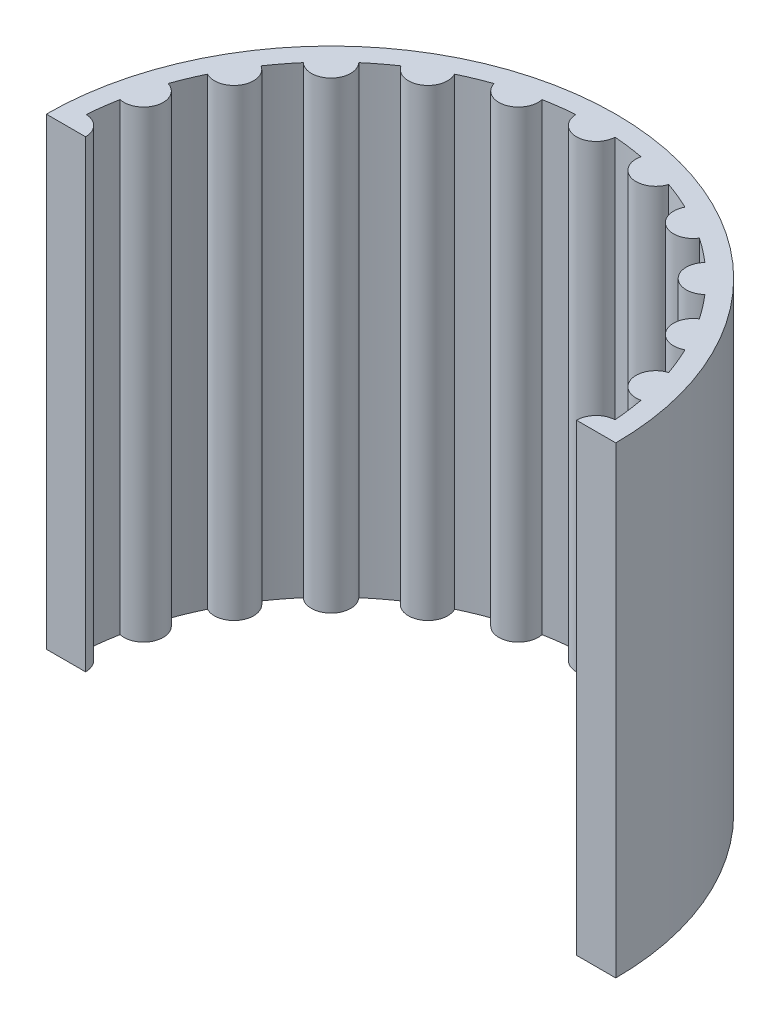
ISO-10303-21;
HEADER;
FILE_DESCRIPTION(('STEP AP214'),'2;1');
FILE_NAME('part.step','',(''),(''),'','','');
FILE_SCHEMA(('AUTOMOTIVE_DESIGN { 1 0 10303 214 1 1 1 1 }'));
ENDSEC;
DATA;
#1=APPLICATION_CONTEXT('core data for automotive mechanical design processes');
#2=APPLICATION_PROTOCOL_DEFINITION('international standard','automotive_design',2000,#1);
#3=PRODUCT_CONTEXT('',#1,'mechanical');
#4=PRODUCT('Part','Part','',(#3));
#5=PRODUCT_RELATED_PRODUCT_CATEGORY('part','',(#4));
#6=PRODUCT_DEFINITION_FORMATION('','',#4);
#7=PRODUCT_DEFINITION_CONTEXT('part definition',#1,'design');
#8=PRODUCT_DEFINITION('design','',#6,#7);
#9=PRODUCT_DEFINITION_SHAPE('','',#8);
#10=(LENGTH_UNIT() NAMED_UNIT(*) SI_UNIT(.MILLI.,.METRE.));
#11=(NAMED_UNIT(*) PLANE_ANGLE_UNIT() SI_UNIT($,.RADIAN.));
#12=(NAMED_UNIT(*) SI_UNIT($,.STERADIAN.) SOLID_ANGLE_UNIT());
#13=UNCERTAINTY_MEASURE_WITH_UNIT(LENGTH_MEASURE(1.E-05),#10,'distance_accuracy_value','');
#14=(GEOMETRIC_REPRESENTATION_CONTEXT(3) GLOBAL_UNCERTAINTY_ASSIGNED_CONTEXT((#13)) GLOBAL_UNIT_ASSIGNED_CONTEXT((#10,
#11,#12)) REPRESENTATION_CONTEXT('',''));
#15=CARTESIAN_POINT('',(0.,0.,0.));
#16=DIRECTION('',(0.,0.,1.));
#17=DIRECTION('',(1.,0.,0.));
#18=AXIS2_PLACEMENT_3D('',#15,#16,#17);
#19=CARTESIAN_POINT('',(0.,-299.72,0.));
#20=DIRECTION('',(0.,1.,0.));
#21=DIRECTION('',(0.,0.,1.));
#22=AXIS2_PLACEMENT_3D('',#19,#20,#21);
#23=CYLINDRICAL_SURFACE('',#22,171.45);
#24=CARTESIAN_POINT('',(0.,0.,0.));
#25=DIRECTION('',(0.,-1.,0.));
#26=DIRECTION('',(0.,0.,1.));
#27=AXIS2_PLACEMENT_3D('',#24,#25,#26);
#28=CIRCLE('',#27,171.45);
#29=CARTESIAN_POINT('',(-170.97962962963,0.,-12.6912864483739));
#30=VERTEX_POINT('',#29);
#31=CARTESIAN_POINT('',(-168.43838666829,0.,-31.9939431234065));
#32=VERTEX_POINT('',#31);
#33=EDGE_CURVE('E253',#30,#32,#28,.T.);
#34=ORIENTED_EDGE('',*,*,#33,.F.);
#35=DIRECTION('',(0.,1.,0.));
#36=VECTOR('',#35,1.);
#37=CARTESIAN_POINT('',(-170.97962962963,-299.72,-12.6912864483739));
#38=LINE('',#37,#36);
#39=CARTESIAN_POINT('',(-170.97962962963,-299.72,-12.6912864483739));
#40=VERTEX_POINT('',#39);
#41=EDGE_CURVE('E11',#40,#30,#38,.T.);
#42=ORIENTED_EDGE('',*,*,#41,.F.);
#43=CARTESIAN_POINT('',(0.,-299.72,0.));
#44=DIRECTION('',(0.,-1.,0.));
#45=DIRECTION('',(0.,0.,1.));
#46=AXIS2_PLACEMENT_3D('',#43,#44,#45);
#47=CIRCLE('',#46,171.45);
#48=CARTESIAN_POINT('',(-168.43838666829,-299.72,-31.9939431234065));
#49=VERTEX_POINT('',#48);
#50=EDGE_CURVE('E333',#40,#49,#47,.T.);
#51=ORIENTED_EDGE('',*,*,#50,.T.);
#52=DIRECTION('',(0.,1.,0.));
#53=VECTOR('',#52,1.);
#54=CARTESIAN_POINT('',(-168.43838666829,-299.72,-31.9939431234065));
#55=LINE('',#54,#53);
#56=EDGE_CURVE('E39',#49,#32,#55,.T.);
#57=ORIENTED_EDGE('',*,*,#56,.T.);
#58=EDGE_LOOP('',(#34,#42,#51,#57));
#59=FACE_BOUND('',#58,.T.);
#60=ADVANCED_FACE('F36',(#59),#23,.F.);
#61=CARTESIAN_POINT('',(-171.45,-299.72,0.));
#62=DIRECTION('',(0.,1.,0.));
#63=DIRECTION('',(0.,0.,1.));
#64=AXIS2_PLACEMENT_3D('',#61,#62,#63);
#65=CYLINDRICAL_SURFACE('',#64,12.7);
#66=CARTESIAN_POINT('',(-171.45,0.,0.));
#67=DIRECTION('',(0.,1.,0.));
#68=DIRECTION('',(0.,0.,1.));
#69=AXIS2_PLACEMENT_3D('',#66,#67,#68);
#70=CIRCLE('',#69,12.7);
#71=CARTESIAN_POINT('',(-158.75,0.,0.));
#72=VERTEX_POINT('',#71);
#73=EDGE_CURVE('E331',#72,#30,#70,.T.);
#74=ORIENTED_EDGE('',*,*,#73,.F.);
#75=DIRECTION('',(0.,1.,0.));
#76=VECTOR('',#75,1.);
#77=CARTESIAN_POINT('',(-158.75,-299.72,0.));
#78=LINE('',#77,#76);
#79=CARTESIAN_POINT('',(-158.75,-299.72,0.));
#80=VERTEX_POINT('',#79);
#81=EDGE_CURVE('E45',#80,#72,#78,.T.);
#82=ORIENTED_EDGE('',*,*,#81,.F.);
#83=CARTESIAN_POINT('',(-171.45,-299.72,0.));
#84=DIRECTION('',(0.,1.,0.));
#85=DIRECTION('',(0.,0.,1.));
#86=AXIS2_PLACEMENT_3D('',#83,#84,#85);
#87=CIRCLE('',#86,12.7);
#88=EDGE_CURVE('E243',#80,#40,#87,.T.);
#89=ORIENTED_EDGE('',*,*,#88,.T.);
#90=ORIENTED_EDGE('',*,*,#41,.T.);
#91=EDGE_LOOP('',(#74,#82,#89,#90));
#92=FACE_BOUND('',#91,.T.);
#93=ADVANCED_FACE('F385',(#92),#65,.T.);
#94=CARTESIAN_POINT('',(-184.15,-299.72,0.));
#95=DIRECTION('',(0.,0.,1.));
#96=DIRECTION('',(1.,0.,0.));
#97=AXIS2_PLACEMENT_3D('',#94,#95,#96);
#98=PLANE('',#97);
#99=DIRECTION('',(1.,0.,0.));
#100=VECTOR('',#99,1.);
#101=CARTESIAN_POINT('',(-184.15,0.,0.));
#102=LINE('',#101,#100);
#103=CARTESIAN_POINT('',(-184.15,0.,0.));
#104=VERTEX_POINT('',#103);
#105=EDGE_CURVE('E230',#104,#72,#102,.T.);
#106=ORIENTED_EDGE('',*,*,#105,.F.);
#107=DIRECTION('',(0.,1.,0.));
#108=VECTOR('',#107,1.);
#109=CARTESIAN_POINT('',(-184.15,-299.72,0.));
#110=LINE('',#109,#108);
#111=CARTESIAN_POINT('',(-184.15,-299.72,0.));
#112=VERTEX_POINT('',#111);
#113=EDGE_CURVE('E225',#112,#104,#110,.T.);
#114=ORIENTED_EDGE('',*,*,#113,.F.);
#115=DIRECTION('',(1.,0.,0.));
#116=VECTOR('',#115,1.);
#117=CARTESIAN_POINT('',(-184.15,-299.72,0.));
#118=LINE('',#117,#116);
#119=EDGE_CURVE('E228',#112,#80,#118,.T.);
#120=ORIENTED_EDGE('',*,*,#119,.T.);
#121=ORIENTED_EDGE('',*,*,#81,.T.);
#122=EDGE_LOOP('',(#106,#114,#120,#121));
#123=FACE_BOUND('',#122,.T.);
#124=ADVANCED_FACE('F227',(#123),#98,.T.);
#125=CARTESIAN_POINT('',(0.,-299.72,0.));
#126=DIRECTION('',(0.,1.,0.));
#127=DIRECTION('',(0.,0.,1.));
#128=AXIS2_PLACEMENT_3D('',#125,#126,#127);
#129=CYLINDRICAL_SURFACE('',#128,184.15);
#130=CARTESIAN_POINT('',(0.,0.,0.));
#131=DIRECTION('',(0.,1.,0.));
#132=DIRECTION('',(0.,0.,1.));
#133=AXIS2_PLACEMENT_3D('',#130,#131,#132);
#134=CIRCLE('',#133,184.15);
#135=CARTESIAN_POINT('',(184.15,0.,0.));
#136=VERTEX_POINT('',#135);
#137=EDGE_CURVE('E328',#136,#104,#134,.T.);
#138=ORIENTED_EDGE('',*,*,#137,.F.);
#139=DIRECTION('',(0.,1.,0.));
#140=VECTOR('',#139,1.);
#141=CARTESIAN_POINT('',(184.15,-299.72,0.));
#142=LINE('',#141,#140);
#143=CARTESIAN_POINT('',(184.15,-299.72,0.));
#144=VERTEX_POINT('',#143);
#145=EDGE_CURVE('E235',#144,#136,#142,.T.);
#146=ORIENTED_EDGE('',*,*,#145,.F.);
#147=CARTESIAN_POINT('',(0.,-299.72,0.));
#148=DIRECTION('',(0.,1.,0.));
#149=DIRECTION('',(0.,0.,1.));
#150=AXIS2_PLACEMENT_3D('',#147,#148,#149);
#151=CIRCLE('',#150,184.15);
#152=EDGE_CURVE('E241',#144,#112,#151,.T.);
#153=ORIENTED_EDGE('',*,*,#152,.T.);
#154=ORIENTED_EDGE('',*,*,#113,.T.);
#155=EDGE_LOOP('',(#138,#146,#153,#154));
#156=FACE_BOUND('',#155,.T.);
#157=ADVANCED_FACE('F245',(#156),#129,.T.);
#158=CARTESIAN_POINT('',(158.75,-299.72,1.19722895108931E-12));
#159=DIRECTION('',(0.,0.,1.));
#160=DIRECTION('',(1.,0.,0.));
#161=AXIS2_PLACEMENT_3D('',#158,#159,#160);
#162=PLANE('',#161);
#163=DIRECTION('',(1.,0.,0.));
#164=VECTOR('',#163,1.);
#165=CARTESIAN_POINT('',(158.75,0.,1.19722895108931E-12));
#166=LINE('',#165,#164);
#167=CARTESIAN_POINT('',(158.75,0.,1.19722895108931E-12));
#168=VERTEX_POINT('',#167);
#169=EDGE_CURVE('E325',#168,#136,#166,.T.);
#170=ORIENTED_EDGE('',*,*,#169,.F.);
#171=DIRECTION('',(0.,1.,0.));
#172=VECTOR('',#171,1.);
#173=CARTESIAN_POINT('',(158.75,-299.72,1.19722895108931E-12));
#174=LINE('',#173,#172);
#175=CARTESIAN_POINT('',(158.75,-299.72,1.19722895108931E-12));
#176=VERTEX_POINT('',#175);
#177=EDGE_CURVE('E337',#176,#168,#174,.T.);
#178=ORIENTED_EDGE('',*,*,#177,.F.);
#179=DIRECTION('',(1.,0.,0.));
#180=VECTOR('',#179,1.);
#181=CARTESIAN_POINT('',(158.75,-299.72,1.19722895108931E-12));
#182=LINE('',#181,#180);
#183=EDGE_CURVE('E246',#176,#144,#182,.T.);
#184=ORIENTED_EDGE('',*,*,#183,.T.);
#185=ORIENTED_EDGE('',*,*,#145,.T.);
#186=EDGE_LOOP('',(#170,#178,#184,#185));
#187=FACE_BOUND('',#186,.T.);
#188=ADVANCED_FACE('F398',(#187),#162,.T.);
#189=CARTESIAN_POINT('',(171.45,-299.72,1.19722895108931E-12));
#190=DIRECTION('',(0.,1.,0.));
#191=DIRECTION('',(0.,0.,1.));
#192=AXIS2_PLACEMENT_3D('',#189,#190,#191);
#193=CYLINDRICAL_SURFACE('',#192,12.7);
#194=CARTESIAN_POINT('',(171.45,0.,1.19722895108931E-12));
#195=DIRECTION('',(0.,1.,0.));
#196=DIRECTION('',(0.,0.,1.));
#197=AXIS2_PLACEMENT_3D('',#194,#195,#196);
#198=CIRCLE('',#197,12.7);
#199=CARTESIAN_POINT('',(170.97962962963,0.,-12.6912864483727));
#200=VERTEX_POINT('',#199);
#201=EDGE_CURVE('E322',#200,#168,#198,.T.);
#202=ORIENTED_EDGE('',*,*,#201,.F.);
#203=DIRECTION('',(0.,1.,0.));
#204=VECTOR('',#203,1.);
#205=CARTESIAN_POINT('',(170.97962962963,-299.72,-12.6912864483727));
#206=LINE('',#205,#204);
#207=CARTESIAN_POINT('',(170.97962962963,-299.72,-12.6912864483727));
#208=VERTEX_POINT('',#207);
#209=EDGE_CURVE('E339',#208,#200,#206,.T.);
#210=ORIENTED_EDGE('',*,*,#209,.F.);
#211=CARTESIAN_POINT('',(171.45,-299.72,1.19722895108931E-12));
#212=DIRECTION('',(0.,1.,0.));
#213=DIRECTION('',(0.,0.,1.));
#214=AXIS2_PLACEMENT_3D('',#211,#212,#213);
#215=CIRCLE('',#214,12.7);
#216=EDGE_CURVE('E248',#208,#176,#215,.T.);
#217=ORIENTED_EDGE('',*,*,#216,.T.);
#218=ORIENTED_EDGE('',*,*,#177,.T.);
#219=EDGE_LOOP('',(#202,#210,#217,#218));
#220=FACE_BOUND('',#219,.T.);
#221=ADVANCED_FACE('F401',(#220),#193,.T.);
#222=CARTESIAN_POINT('',(0.,-299.72,0.));
#223=DIRECTION('',(0.,1.,0.));
#224=DIRECTION('',(0.,0.,1.));
#225=AXIS2_PLACEMENT_3D('',#222,#223,#224);
#226=CYLINDRICAL_SURFACE('',#225,171.45);
#227=CARTESIAN_POINT('',(0.,0.,0.));
#228=DIRECTION('',(0.,-1.,0.));
#229=DIRECTION('',(0.,0.,1.));
#230=AXIS2_PLACEMENT_3D('',#227,#228,#229);
#231=CIRCLE('',#230,171.45);
#232=CARTESIAN_POINT('',(168.43838666829,0.,-31.9939431234056));
#233=VERTEX_POINT('',#232);
#234=EDGE_CURVE('E319',#233,#200,#231,.T.);
#235=ORIENTED_EDGE('',*,*,#234,.F.);
#236=DIRECTION('',(0.,1.,0.));
#237=VECTOR('',#236,1.);
#238=CARTESIAN_POINT('',(168.43838666829,-299.72,-31.9939431234056));
#239=LINE('',#238,#237);
#240=CARTESIAN_POINT('',(168.43838666829,-299.72,-31.9939431234056));
#241=VERTEX_POINT('',#240);
#242=EDGE_CURVE('E341',#241,#233,#239,.T.);
#243=ORIENTED_EDGE('',*,*,#242,.F.);
#244=CARTESIAN_POINT('',(0.,-299.72,0.));
#245=DIRECTION('',(0.,-1.,0.));
#246=DIRECTION('',(0.,0.,1.));
#247=AXIS2_PLACEMENT_3D('',#244,#245,#246);
#248=CIRCLE('',#247,171.45);
#249=EDGE_CURVE('E746',#241,#208,#248,.T.);
#250=ORIENTED_EDGE('',*,*,#249,.T.);
#251=ORIENTED_EDGE('',*,*,#209,.T.);
#252=EDGE_LOOP('',(#235,#243,#250,#251));
#253=FACE_BOUND('',#252,.T.);
#254=ADVANCED_FACE('F405',(#253),#226,.F.);
#255=CARTESIAN_POINT('',(165.607982917261,-299.72,-44.3745252828261));
#256=DIRECTION('',(0.,1.,0.));
#257=DIRECTION('',(0.,0.,1.));
#258=AXIS2_PLACEMENT_3D('',#255,#256,#257);
#259=CYLINDRICAL_SURFACE('',#258,12.7);
#260=CARTESIAN_POINT('',(165.607982917261,0.,-44.3745252828261));
#261=DIRECTION('',(0.,1.,0.));
#262=DIRECTION('',(0.,0.,1.));
#263=AXIS2_PLACEMENT_3D('',#260,#261,#262);
#264=CIRCLE('',#263,12.7);
#265=CARTESIAN_POINT('',(161.868893388909,0.,-56.5116258220391));
#266=VERTEX_POINT('',#265);
#267=EDGE_CURVE('E316',#266,#233,#264,.T.);
#268=ORIENTED_EDGE('',*,*,#267,.F.);
#269=DIRECTION('',(0.,1.,0.));
#270=VECTOR('',#269,1.);
#271=CARTESIAN_POINT('',(161.868893388909,-299.72,-56.5116258220391));
#272=LINE('',#271,#270);
#273=CARTESIAN_POINT('',(161.868893388909,-299.72,-56.5116258220391));
#274=VERTEX_POINT('',#273);
#275=EDGE_CURVE('E343',#274,#266,#272,.T.);
#276=ORIENTED_EDGE('',*,*,#275,.F.);
#277=CARTESIAN_POINT('',(165.607982917261,-299.72,-44.3745252828261));
#278=DIRECTION('',(0.,1.,0.));
#279=DIRECTION('',(0.,0.,1.));
#280=AXIS2_PLACEMENT_3D('',#277,#278,#279);
#281=CIRCLE('',#280,12.7);
#282=EDGE_CURVE('E742',#274,#241,#281,.T.);
#283=ORIENTED_EDGE('',*,*,#282,.T.);
#284=ORIENTED_EDGE('',*,*,#242,.T.);
#285=EDGE_LOOP('',(#268,#276,#283,#284));
#286=FACE_BOUND('',#285,.T.);
#287=ADVANCED_FACE('F409',(#286),#259,.T.);
#288=CARTESIAN_POINT('',(0.,-299.72,0.));
#289=DIRECTION('',(0.,1.,0.));
#290=DIRECTION('',(0.,0.,1.));
#291=AXIS2_PLACEMENT_3D('',#288,#289,#290);
#292=CYLINDRICAL_SURFACE('',#291,171.45);
#293=CARTESIAN_POINT('',(0.,0.,0.));
#294=DIRECTION('',(0.,-1.,0.));
#295=DIRECTION('',(0.,0.,1.));
#296=AXIS2_PLACEMENT_3D('',#293,#294,#295);
#297=CIRCLE('',#296,171.45);
#298=CARTESIAN_POINT('',(154.418346013101,0.,-74.498838343817));
#299=VERTEX_POINT('',#298);
#300=EDGE_CURVE('E313',#299,#266,#297,.T.);
#301=ORIENTED_EDGE('',*,*,#300,.F.);
#302=DIRECTION('',(0.,1.,0.));
#303=VECTOR('',#302,1.);
#304=CARTESIAN_POINT('',(154.418346013101,-299.72,-74.498838343817));
#305=LINE('',#304,#303);
#306=CARTESIAN_POINT('',(154.418346013101,-299.72,-74.498838343817));
#307=VERTEX_POINT('',#306);
#308=EDGE_CURVE('E345',#307,#299,#305,.T.);
#309=ORIENTED_EDGE('',*,*,#308,.F.);
#310=CARTESIAN_POINT('',(0.,-299.72,0.));
#311=DIRECTION('',(0.,-1.,0.));
#312=DIRECTION('',(0.,0.,1.));
#313=AXIS2_PLACEMENT_3D('',#310,#311,#312);
#314=CIRCLE('',#313,171.45);
#315=EDGE_CURVE('E753',#307,#274,#314,.T.);
#316=ORIENTED_EDGE('',*,*,#315,.T.);
#317=ORIENTED_EDGE('',*,*,#275,.T.);
#318=EDGE_LOOP('',(#301,#309,#316,#317));
#319=FACE_BOUND('',#318,.T.);
#320=ADVANCED_FACE('F413',(#319),#292,.F.);
#321=CARTESIAN_POINT('',(148.480055478843,-299.72,-85.7249999999992));
#322=DIRECTION('',(0.,1.,0.));
#323=DIRECTION('',(0.,0.,1.));
#324=AXIS2_PLACEMENT_3D('',#321,#322,#323);
#325=CYLINDRICAL_SURFACE('',#324,12.7);
#326=CARTESIAN_POINT('',(148.480055478843,0.,-85.7249999999992));
#327=DIRECTION('',(0.,1.,0.));
#328=DIRECTION('',(0.,0.,1.));
#329=AXIS2_PLACEMENT_3D('',#326,#327,#328);
#330=CIRCLE('',#329,12.7);
#331=CARTESIAN_POINT('',(141.727059564727,0.,-96.4807912858109));
#332=VERTEX_POINT('',#331);
#333=EDGE_CURVE('E310',#332,#299,#330,.T.);
#334=ORIENTED_EDGE('',*,*,#333,.F.);
#335=DIRECTION('',(0.,1.,0.));
#336=VECTOR('',#335,1.);
#337=CARTESIAN_POINT('',(141.727059564727,-299.72,-96.4807912858109));
#338=LINE('',#337,#336);
#339=CARTESIAN_POINT('',(141.727059564727,-299.72,-96.4807912858109));
#340=VERTEX_POINT('',#339);
#341=EDGE_CURVE('E347',#340,#332,#338,.T.);
#342=ORIENTED_EDGE('',*,*,#341,.F.);
#343=CARTESIAN_POINT('',(148.480055478843,-299.72,-85.7249999999992));
#344=DIRECTION('',(0.,1.,0.));
#345=DIRECTION('',(0.,0.,1.));
#346=AXIS2_PLACEMENT_3D('',#343,#344,#345);
#347=CIRCLE('',#346,12.7);
#348=EDGE_CURVE('E735',#340,#307,#347,.T.);
#349=ORIENTED_EDGE('',*,*,#348,.T.);
#350=ORIENTED_EDGE('',*,*,#308,.T.);
#351=EDGE_LOOP('',(#334,#342,#349,#350));
#352=FACE_BOUND('',#351,.T.);
#353=ADVANCED_FACE('F417',(#352),#325,.T.);
#354=CARTESIAN_POINT('',(0.,-299.72,0.));
#355=DIRECTION('',(0.,1.,0.));
#356=DIRECTION('',(0.,0.,1.));
#357=AXIS2_PLACEMENT_3D('',#354,#355,#356);
#358=CYLINDRICAL_SURFACE('',#357,171.45);
#359=CARTESIAN_POINT('',(0.,0.,0.));
#360=DIRECTION('',(0.,-1.,0.));
#361=DIRECTION('',(0.,0.,1.));
#362=AXIS2_PLACEMENT_3D('',#359,#360,#361);
#363=CIRCLE('',#362,171.45);
#364=CARTESIAN_POINT('',(129.874950265502,0.,-111.926760846249));
#365=VERTEX_POINT('',#364);
#366=EDGE_CURVE('E307',#365,#332,#363,.T.);
#367=ORIENTED_EDGE('',*,*,#366,.F.);
#368=DIRECTION('',(0.,1.,0.));
#369=VECTOR('',#368,1.);
#370=CARTESIAN_POINT('',(129.874950265502,-299.72,-111.926760846249));
#371=LINE('',#370,#369);
#372=CARTESIAN_POINT('',(129.874950265502,-299.72,-111.926760846249));
#373=VERTEX_POINT('',#372);
#374=EDGE_CURVE('E349',#373,#365,#371,.T.);
#375=ORIENTED_EDGE('',*,*,#374,.F.);
#376=CARTESIAN_POINT('',(0.,-299.72,0.));
#377=DIRECTION('',(0.,-1.,0.));
#378=DIRECTION('',(0.,0.,1.));
#379=AXIS2_PLACEMENT_3D('',#376,#377,#378);
#380=CIRCLE('',#379,171.45);
#381=EDGE_CURVE('E731',#373,#340,#380,.T.);
#382=ORIENTED_EDGE('',*,*,#381,.T.);
#383=ORIENTED_EDGE('',*,*,#341,.T.);
#384=EDGE_LOOP('',(#367,#375,#382,#383));
#385=FACE_BOUND('',#384,.T.);
#386=ADVANCED_FACE('F421',(#385),#358,.F.);
#387=CARTESIAN_POINT('',(121.233457634434,-299.72,-121.233457634433));
#388=DIRECTION('',(0.,1.,0.));
#389=DIRECTION('',(0.,0.,1.));
#390=AXIS2_PLACEMENT_3D('',#387,#388,#389);
#391=CYLINDRICAL_SURFACE('',#390,12.7);
#392=CARTESIAN_POINT('',(121.233457634434,0.,-121.233457634433));
#393=DIRECTION('',(0.,1.,0.));
#394=DIRECTION('',(0.,0.,1.));
#395=AXIS2_PLACEMENT_3D('',#392,#393,#394);
#396=CIRCLE('',#395,12.7);
#397=CARTESIAN_POINT('',(111.92676084625,0.,-129.874950265501));
#398=VERTEX_POINT('',#397);
#399=EDGE_CURVE('E304',#398,#365,#396,.T.);
#400=ORIENTED_EDGE('',*,*,#399,.F.);
#401=DIRECTION('',(0.,1.,0.));
#402=VECTOR('',#401,1.);
#403=CARTESIAN_POINT('',(111.92676084625,-299.72,-129.874950265501));
#404=LINE('',#403,#402);
#405=CARTESIAN_POINT('',(111.92676084625,-299.72,-129.874950265501));
#406=VERTEX_POINT('',#405);
#407=EDGE_CURVE('E351',#406,#398,#404,.T.);
#408=ORIENTED_EDGE('',*,*,#407,.F.);
#409=CARTESIAN_POINT('',(121.233457634434,-299.72,-121.233457634433));
#410=DIRECTION('',(0.,1.,0.));
#411=DIRECTION('',(0.,0.,1.));
#412=AXIS2_PLACEMENT_3D('',#409,#410,#411);
#413=CIRCLE('',#412,12.7);
#414=EDGE_CURVE('E757',#406,#373,#413,.T.);
#415=ORIENTED_EDGE('',*,*,#414,.T.);
#416=ORIENTED_EDGE('',*,*,#374,.T.);
#417=EDGE_LOOP('',(#400,#408,#415,#416));
#418=FACE_BOUND('',#417,.T.);
#419=ADVANCED_FACE('F425',(#418),#391,.T.);
#420=CARTESIAN_POINT('',(0.,-299.72,0.));
#421=DIRECTION('',(0.,1.,0.));
#422=DIRECTION('',(0.,0.,1.));
#423=AXIS2_PLACEMENT_3D('',#420,#421,#422);
#424=CYLINDRICAL_SURFACE('',#423,171.45);
#425=CARTESIAN_POINT('',(0.,0.,0.));
#426=DIRECTION('',(0.,-1.,0.));
#427=DIRECTION('',(0.,0.,1.));
#428=AXIS2_PLACEMENT_3D('',#425,#426,#427);
#429=CIRCLE('',#428,171.45);
#430=CARTESIAN_POINT('',(96.4807912858123,0.,-141.727059564726));
#431=VERTEX_POINT('',#430);
#432=EDGE_CURVE('E301',#431,#398,#429,.T.);
#433=ORIENTED_EDGE('',*,*,#432,.F.);
#434=DIRECTION('',(0.,1.,0.));
#435=VECTOR('',#434,1.);
#436=CARTESIAN_POINT('',(96.4807912858123,-299.72,-141.727059564726));
#437=LINE('',#436,#435);
#438=CARTESIAN_POINT('',(96.4807912858123,-299.72,-141.727059564726));
#439=VERTEX_POINT('',#438);
#440=EDGE_CURVE('E353',#439,#431,#437,.T.);
#441=ORIENTED_EDGE('',*,*,#440,.F.);
#442=CARTESIAN_POINT('',(0.,-299.72,0.));
#443=DIRECTION('',(0.,-1.,0.));
#444=DIRECTION('',(0.,0.,1.));
#445=AXIS2_PLACEMENT_3D('',#442,#443,#444);
#446=CIRCLE('',#445,171.45);
#447=EDGE_CURVE('E724',#439,#406,#446,.T.);
#448=ORIENTED_EDGE('',*,*,#447,.T.);
#449=ORIENTED_EDGE('',*,*,#407,.T.);
#450=EDGE_LOOP('',(#433,#441,#448,#449));
#451=FACE_BOUND('',#450,.T.);
#452=ADVANCED_FACE('F429',(#451),#424,.F.);
#453=CARTESIAN_POINT('',(85.7250000000007,-299.72,-148.480055478842));
#454=DIRECTION('',(0.,1.,0.));
#455=DIRECTION('',(0.,0.,1.));
#456=AXIS2_PLACEMENT_3D('',#453,#454,#455);
#457=CYLINDRICAL_SURFACE('',#456,12.7);
#458=CARTESIAN_POINT('',(85.7250000000007,0.,-148.480055478842));
#459=DIRECTION('',(0.,1.,0.));
#460=DIRECTION('',(0.,0.,1.));
#461=AXIS2_PLACEMENT_3D('',#458,#459,#460);
#462=CIRCLE('',#461,12.7);
#463=CARTESIAN_POINT('',(74.4988383438186,0.,-154.4183460131));
#464=VERTEX_POINT('',#463);
#465=EDGE_CURVE('E298',#464,#431,#462,.T.);
#466=ORIENTED_EDGE('',*,*,#465,.F.);
#467=DIRECTION('',(0.,1.,0.));
#468=VECTOR('',#467,1.);
#469=CARTESIAN_POINT('',(74.4988383438186,-299.72,-154.4183460131));
#470=LINE('',#469,#468);
#471=CARTESIAN_POINT('',(74.4988383438186,-299.72,-154.4183460131));
#472=VERTEX_POINT('',#471);
#473=EDGE_CURVE('E355',#472,#464,#470,.T.);
#474=ORIENTED_EDGE('',*,*,#473,.F.);
#475=CARTESIAN_POINT('',(85.7250000000007,-299.72,-148.480055478842));
#476=DIRECTION('',(0.,1.,0.));
#477=DIRECTION('',(0.,0.,1.));
#478=AXIS2_PLACEMENT_3D('',#475,#476,#477);
#479=CIRCLE('',#478,12.7);
#480=EDGE_CURVE('E720',#472,#439,#479,.T.);
#481=ORIENTED_EDGE('',*,*,#480,.T.);
#482=ORIENTED_EDGE('',*,*,#440,.T.);
#483=EDGE_LOOP('',(#466,#474,#481,#482));
#484=FACE_BOUND('',#483,.T.);
#485=ADVANCED_FACE('F433',(#484),#457,.T.);
#486=CARTESIAN_POINT('',(0.,-299.72,0.));
#487=DIRECTION('',(0.,1.,0.));
#488=DIRECTION('',(0.,0.,1.));
#489=AXIS2_PLACEMENT_3D('',#486,#487,#488);
#490=CYLINDRICAL_SURFACE('',#489,171.45);
#491=CARTESIAN_POINT('',(0.,0.,0.));
#492=DIRECTION('',(0.,-1.,0.));
#493=DIRECTION('',(0.,0.,1.));
#494=AXIS2_PLACEMENT_3D('',#491,#492,#493);
#495=CIRCLE('',#494,171.45);
#496=CARTESIAN_POINT('',(56.5116258220408,0.,-161.868893388908));
#497=VERTEX_POINT('',#496);
#498=EDGE_CURVE('E295',#497,#464,#495,.T.);
#499=ORIENTED_EDGE('',*,*,#498,.F.);
#500=DIRECTION('',(0.,1.,0.));
#501=VECTOR('',#500,1.);
#502=CARTESIAN_POINT('',(56.5116258220408,-299.72,-161.868893388908));
#503=LINE('',#502,#501);
#504=CARTESIAN_POINT('',(56.5116258220408,-299.72,-161.868893388908));
#505=VERTEX_POINT('',#504);
#506=EDGE_CURVE('E357',#505,#497,#503,.T.);
#507=ORIENTED_EDGE('',*,*,#506,.F.);
#508=CARTESIAN_POINT('',(0.,-299.72,0.));
#509=DIRECTION('',(0.,-1.,0.));
#510=DIRECTION('',(0.,0.,1.));
#511=AXIS2_PLACEMENT_3D('',#508,#509,#510);
#512=CIRCLE('',#511,171.45);
#513=EDGE_CURVE('E761',#505,#472,#512,.T.);
#514=ORIENTED_EDGE('',*,*,#513,.T.);
#515=ORIENTED_EDGE('',*,*,#473,.T.);
#516=EDGE_LOOP('',(#499,#507,#514,#515));
#517=FACE_BOUND('',#516,.T.);
#518=ADVANCED_FACE('F437',(#517),#490,.F.);
#519=CARTESIAN_POINT('',(44.3745252828279,-299.72,-165.607982917261));
#520=DIRECTION('',(0.,1.,0.));
#521=DIRECTION('',(0.,0.,1.));
#522=AXIS2_PLACEMENT_3D('',#519,#520,#521);
#523=CYLINDRICAL_SURFACE('',#522,12.7);
#524=CARTESIAN_POINT('',(44.3745252828279,0.,-165.607982917261));
#525=DIRECTION('',(0.,1.,0.));
#526=DIRECTION('',(0.,0.,1.));
#527=AXIS2_PLACEMENT_3D('',#524,#525,#526);
#528=CIRCLE('',#527,12.7);
#529=CARTESIAN_POINT('',(31.9939431234074,0.,-168.438386668289));
#530=VERTEX_POINT('',#529);
#531=EDGE_CURVE('E292',#530,#497,#528,.T.);
#532=ORIENTED_EDGE('',*,*,#531,.F.);
#533=DIRECTION('',(0.,1.,0.));
#534=VECTOR('',#533,1.);
#535=CARTESIAN_POINT('',(31.9939431234074,-299.72,-168.438386668289));
#536=LINE('',#535,#534);
#537=CARTESIAN_POINT('',(31.9939431234074,-299.72,-168.438386668289));
#538=VERTEX_POINT('',#537);
#539=EDGE_CURVE('E359',#538,#530,#536,.T.);
#540=ORIENTED_EDGE('',*,*,#539,.F.);
#541=CARTESIAN_POINT('',(44.3745252828279,-299.72,-165.607982917261));
#542=DIRECTION('',(0.,1.,0.));
#543=DIRECTION('',(0.,0.,1.));
#544=AXIS2_PLACEMENT_3D('',#541,#542,#543);
#545=CIRCLE('',#544,12.7);
#546=EDGE_CURVE('E713',#538,#505,#545,.T.);
#547=ORIENTED_EDGE('',*,*,#546,.T.);
#548=ORIENTED_EDGE('',*,*,#506,.T.);
#549=EDGE_LOOP('',(#532,#540,#547,#548));
#550=FACE_BOUND('',#549,.T.);
#551=ADVANCED_FACE('F441',(#550),#523,.T.);
#552=CARTESIAN_POINT('',(0.,-299.72,0.));
#553=DIRECTION('',(0.,1.,0.));
#554=DIRECTION('',(0.,0.,1.));
#555=AXIS2_PLACEMENT_3D('',#552,#553,#554);
#556=CYLINDRICAL_SURFACE('',#555,171.45);
#557=CARTESIAN_POINT('',(0.,0.,0.));
#558=DIRECTION('',(0.,-1.,0.));
#559=DIRECTION('',(0.,0.,1.));
#560=AXIS2_PLACEMENT_3D('',#557,#558,#559);
#561=CIRCLE('',#560,171.45);
#562=CARTESIAN_POINT('',(12.6912864483744,0.,-170.97962962963));
#563=VERTEX_POINT('',#562);
#564=EDGE_CURVE('E289',#563,#530,#561,.T.);
#565=ORIENTED_EDGE('',*,*,#564,.F.);
#566=DIRECTION('',(0.,1.,0.));
#567=VECTOR('',#566,1.);
#568=CARTESIAN_POINT('',(12.6912864483744,-299.72,-170.97962962963));
#569=LINE('',#568,#567);
#570=CARTESIAN_POINT('',(12.6912864483744,-299.72,-170.97962962963));
#571=VERTEX_POINT('',#570);
#572=EDGE_CURVE('E361',#571,#563,#569,.T.);
#573=ORIENTED_EDGE('',*,*,#572,.F.);
#574=CARTESIAN_POINT('',(0.,-299.72,0.));
#575=DIRECTION('',(0.,-1.,0.));
#576=DIRECTION('',(0.,0.,1.));
#577=AXIS2_PLACEMENT_3D('',#574,#575,#576);
#578=CIRCLE('',#577,171.45);
#579=EDGE_CURVE('E709',#571,#538,#578,.T.);
#580=ORIENTED_EDGE('',*,*,#579,.T.);
#581=ORIENTED_EDGE('',*,*,#539,.T.);
#582=EDGE_LOOP('',(#565,#573,#580,#581));
#583=FACE_BOUND('',#582,.T.);
#584=ADVANCED_FACE('F445',(#583),#556,.F.);
#585=CARTESIAN_POINT('',(5.98614475544655E-13,-299.72,-171.45));
#586=DIRECTION('',(0.,1.,0.));
#587=DIRECTION('',(0.,0.,1.));
#588=AXIS2_PLACEMENT_3D('',#585,#586,#587);
#589=CYLINDRICAL_SURFACE('',#588,12.7);
#590=CARTESIAN_POINT('',(5.98614475544655E-13,0.,-171.45));
#591=DIRECTION('',(0.,1.,0.));
#592=DIRECTION('',(0.,0.,1.));
#593=AXIS2_PLACEMENT_3D('',#590,#591,#592);
#594=CIRCLE('',#593,12.7);
#595=CARTESIAN_POINT('',(-12.6912864483732,0.,-170.97962962963));
#596=VERTEX_POINT('',#595);
#597=EDGE_CURVE('E286',#596,#563,#594,.T.);
#598=ORIENTED_EDGE('',*,*,#597,.F.);
#599=DIRECTION('',(0.,1.,0.));
#600=VECTOR('',#599,1.);
#601=CARTESIAN_POINT('',(-12.6912864483732,-299.72,-170.97962962963));
#602=LINE('',#601,#600);
#603=CARTESIAN_POINT('',(-12.6912864483732,-299.72,-170.97962962963));
#604=VERTEX_POINT('',#603);
#605=EDGE_CURVE('E363',#604,#596,#602,.T.);
#606=ORIENTED_EDGE('',*,*,#605,.F.);
#607=CARTESIAN_POINT('',(5.98614475544655E-13,-299.72,-171.45));
#608=DIRECTION('',(0.,1.,0.));
#609=DIRECTION('',(0.,0.,1.));
#610=AXIS2_PLACEMENT_3D('',#607,#608,#609);
#611=CIRCLE('',#610,12.7);
#612=EDGE_CURVE('E765',#604,#571,#611,.T.);
#613=ORIENTED_EDGE('',*,*,#612,.T.);
#614=ORIENTED_EDGE('',*,*,#572,.T.);
#615=EDGE_LOOP('',(#598,#606,#613,#614));
#616=FACE_BOUND('',#615,.T.);
#617=ADVANCED_FACE('F449',(#616),#589,.T.);
#618=CARTESIAN_POINT('',(0.,-299.72,0.));
#619=DIRECTION('',(0.,1.,0.));
#620=DIRECTION('',(0.,0.,1.));
#621=AXIS2_PLACEMENT_3D('',#618,#619,#620);
#622=CYLINDRICAL_SURFACE('',#621,171.45);
#623=CARTESIAN_POINT('',(0.,0.,0.));
#624=DIRECTION('',(0.,-1.,0.));
#625=DIRECTION('',(0.,0.,1.));
#626=AXIS2_PLACEMENT_3D('',#623,#624,#625);
#627=CIRCLE('',#626,171.45);
#628=CARTESIAN_POINT('',(-31.9939431234057,0.,-168.43838666829));
#629=VERTEX_POINT('',#628);
#630=EDGE_CURVE('E283',#629,#596,#627,.T.);
#631=ORIENTED_EDGE('',*,*,#630,.F.);
#632=DIRECTION('',(0.,1.,0.));
#633=VECTOR('',#632,1.);
#634=CARTESIAN_POINT('',(-31.9939431234057,-299.72,-168.43838666829));
#635=LINE('',#634,#633);
#636=CARTESIAN_POINT('',(-31.9939431234057,-299.72,-168.43838666829));
#637=VERTEX_POINT('',#636);
#638=EDGE_CURVE('E365',#637,#629,#635,.T.);
#639=ORIENTED_EDGE('',*,*,#638,.F.);
#640=CARTESIAN_POINT('',(0.,-299.72,0.));
#641=DIRECTION('',(0.,-1.,0.));
#642=DIRECTION('',(0.,0.,1.));
#643=AXIS2_PLACEMENT_3D('',#640,#641,#642);
#644=CIRCLE('',#643,171.45);
#645=EDGE_CURVE('E702',#637,#604,#644,.T.);
#646=ORIENTED_EDGE('',*,*,#645,.T.);
#647=ORIENTED_EDGE('',*,*,#605,.T.);
#648=EDGE_LOOP('',(#631,#639,#646,#647));
#649=FACE_BOUND('',#648,.T.);
#650=ADVANCED_FACE('F453',(#649),#622,.F.);
#651=CARTESIAN_POINT('',(-44.3745252828267,-299.72,-165.607982917261));
#652=DIRECTION('',(0.,1.,0.));
#653=DIRECTION('',(0.,0.,1.));
#654=AXIS2_PLACEMENT_3D('',#651,#652,#653);
#655=CYLINDRICAL_SURFACE('',#654,12.7000000000003);
#656=CARTESIAN_POINT('',(-44.3745252828267,0.,-165.607982917261));
#657=DIRECTION('',(0.,1.,0.));
#658=DIRECTION('',(0.,0.,1.));
#659=AXIS2_PLACEMENT_3D('',#656,#657,#658);
#660=CIRCLE('',#659,12.7000000000003);
#661=CARTESIAN_POINT('',(-56.5116258220399,0.,-161.868893388908));
#662=VERTEX_POINT('',#661);
#663=EDGE_CURVE('E280',#662,#629,#660,.T.);
#664=ORIENTED_EDGE('',*,*,#663,.F.);
#665=DIRECTION('',(0.,1.,0.));
#666=VECTOR('',#665,1.);
#667=CARTESIAN_POINT('',(-56.5116258220399,-299.72,-161.868893388908));
#668=LINE('',#667,#666);
#669=CARTESIAN_POINT('',(-56.5116258220399,-299.72,-161.868893388908));
#670=VERTEX_POINT('',#669);
#671=EDGE_CURVE('E367',#670,#662,#668,.T.);
#672=ORIENTED_EDGE('',*,*,#671,.F.);
#673=CARTESIAN_POINT('',(-44.3745252828267,-299.72,-165.607982917261));
#674=DIRECTION('',(0.,1.,0.));
#675=DIRECTION('',(0.,0.,1.));
#676=AXIS2_PLACEMENT_3D('',#673,#674,#675);
#677=CIRCLE('',#676,12.7000000000003);
#678=EDGE_CURVE('E698',#670,#637,#677,.T.);
#679=ORIENTED_EDGE('',*,*,#678,.T.);
#680=ORIENTED_EDGE('',*,*,#638,.T.);
#681=EDGE_LOOP('',(#664,#672,#679,#680));
#682=FACE_BOUND('',#681,.T.);
#683=ADVANCED_FACE('F457',(#682),#655,.T.);
#684=CARTESIAN_POINT('',(0.,-299.72,0.));
#685=DIRECTION('',(0.,1.,0.));
#686=DIRECTION('',(0.,0.,1.));
#687=AXIS2_PLACEMENT_3D('',#684,#685,#686);
#688=CYLINDRICAL_SURFACE('',#687,171.45);
#689=CARTESIAN_POINT('',(0.,0.,0.));
#690=DIRECTION('',(0.,-1.,0.));
#691=DIRECTION('',(0.,0.,1.));
#692=AXIS2_PLACEMENT_3D('',#689,#690,#691);
#693=CIRCLE('',#692,171.45);
#694=CARTESIAN_POINT('',(-74.4988383438175,0.,-154.418346013101));
#695=VERTEX_POINT('',#694);
#696=EDGE_CURVE('E277',#695,#662,#693,.T.);
#697=ORIENTED_EDGE('',*,*,#696,.F.);
#698=DIRECTION('',(0.,1.,0.));
#699=VECTOR('',#698,1.);
#700=CARTESIAN_POINT('',(-74.4988383438175,-299.72,-154.418346013101));
#701=LINE('',#700,#699);
#702=CARTESIAN_POINT('',(-74.4988383438175,-299.72,-154.418346013101));
#703=VERTEX_POINT('',#702);
#704=EDGE_CURVE('E369',#703,#695,#701,.T.);
#705=ORIENTED_EDGE('',*,*,#704,.F.);
#706=CARTESIAN_POINT('',(0.,-299.72,0.));
#707=DIRECTION('',(0.,-1.,0.));
#708=DIRECTION('',(0.,0.,1.));
#709=AXIS2_PLACEMENT_3D('',#706,#707,#708);
#710=CIRCLE('',#709,171.45);
#711=EDGE_CURVE('E769',#703,#670,#710,.T.);
#712=ORIENTED_EDGE('',*,*,#711,.T.);
#713=ORIENTED_EDGE('',*,*,#671,.T.);
#714=EDGE_LOOP('',(#697,#705,#712,#713));
#715=FACE_BOUND('',#714,.T.);
#716=ADVANCED_FACE('F461',(#715),#688,.F.);
#717=CARTESIAN_POINT('',(-85.7249999999997,-299.72,-148.480055478842));
#718=DIRECTION('',(0.,1.,0.));
#719=DIRECTION('',(0.,0.,1.));
#720=AXIS2_PLACEMENT_3D('',#717,#718,#719);
#721=CYLINDRICAL_SURFACE('',#720,12.7);
#722=CARTESIAN_POINT('',(-85.7249999999997,0.,-148.480055478842));
#723=DIRECTION('',(0.,1.,0.));
#724=DIRECTION('',(0.,0.,1.));
#725=AXIS2_PLACEMENT_3D('',#722,#723,#724);
#726=CIRCLE('',#725,12.7);
#727=CARTESIAN_POINT('',(-96.4807912858114,0.,-141.727059564727));
#728=VERTEX_POINT('',#727);
#729=EDGE_CURVE('E274',#728,#695,#726,.T.);
#730=ORIENTED_EDGE('',*,*,#729,.F.);
#731=DIRECTION('',(0.,1.,0.));
#732=VECTOR('',#731,1.);
#733=CARTESIAN_POINT('',(-96.4807912858114,-299.72,-141.727059564727));
#734=LINE('',#733,#732);
#735=CARTESIAN_POINT('',(-96.4807912858114,-299.72,-141.727059564727));
#736=VERTEX_POINT('',#735);
#737=EDGE_CURVE('E371',#736,#728,#734,.T.);
#738=ORIENTED_EDGE('',*,*,#737,.F.);
#739=CARTESIAN_POINT('',(-85.7249999999997,-299.72,-148.480055478842));
#740=DIRECTION('',(0.,1.,0.));
#741=DIRECTION('',(0.,0.,1.));
#742=AXIS2_PLACEMENT_3D('',#739,#740,#741);
#743=CIRCLE('',#742,12.7);
#744=EDGE_CURVE('E691',#736,#703,#743,.T.);
#745=ORIENTED_EDGE('',*,*,#744,.T.);
#746=ORIENTED_EDGE('',*,*,#704,.T.);
#747=EDGE_LOOP('',(#730,#738,#745,#746));
#748=FACE_BOUND('',#747,.T.);
#749=ADVANCED_FACE('F465',(#748),#721,.T.);
#750=CARTESIAN_POINT('',(0.,-299.72,0.));
#751=DIRECTION('',(0.,1.,0.));
#752=DIRECTION('',(0.,0.,1.));
#753=AXIS2_PLACEMENT_3D('',#750,#751,#752);
#754=CYLINDRICAL_SURFACE('',#753,171.45);
#755=CARTESIAN_POINT('',(0.,0.,0.));
#756=DIRECTION('',(0.,-1.,0.));
#757=DIRECTION('',(0.,0.,1.));
#758=AXIS2_PLACEMENT_3D('',#755,#756,#757);
#759=CIRCLE('',#758,171.45);
#760=CARTESIAN_POINT('',(-111.926760846249,0.,-129.874950265502));
#761=VERTEX_POINT('',#760);
#762=EDGE_CURVE('E271',#761,#728,#759,.T.);
#763=ORIENTED_EDGE('',*,*,#762,.F.);
#764=DIRECTION('',(0.,1.,0.));
#765=VECTOR('',#764,1.);
#766=CARTESIAN_POINT('',(-111.926760846249,-299.72,-129.874950265502));
#767=LINE('',#766,#765);
#768=CARTESIAN_POINT('',(-111.926760846249,-299.72,-129.874950265502));
#769=VERTEX_POINT('',#768);
#770=EDGE_CURVE('E373',#769,#761,#767,.T.);
#771=ORIENTED_EDGE('',*,*,#770,.F.);
#772=CARTESIAN_POINT('',(0.,-299.72,0.));
#773=DIRECTION('',(0.,-1.,0.));
#774=DIRECTION('',(0.,0.,1.));
#775=AXIS2_PLACEMENT_3D('',#772,#773,#774);
#776=CIRCLE('',#775,171.45);
#777=EDGE_CURVE('E687',#769,#736,#776,.T.);
#778=ORIENTED_EDGE('',*,*,#777,.T.);
#779=ORIENTED_EDGE('',*,*,#737,.T.);
#780=EDGE_LOOP('',(#763,#771,#778,#779));
#781=FACE_BOUND('',#780,.T.);
#782=ADVANCED_FACE('F469',(#781),#754,.F.);
#783=CARTESIAN_POINT('',(-121.233457634433,-299.72,-121.233457634434));
#784=DIRECTION('',(0.,1.,0.));
#785=DIRECTION('',(0.,0.,1.));
#786=AXIS2_PLACEMENT_3D('',#783,#784,#785);
#787=CYLINDRICAL_SURFACE('',#786,12.7);
#788=CARTESIAN_POINT('',(-121.233457634433,0.,-121.233457634434));
#789=DIRECTION('',(0.,1.,0.));
#790=DIRECTION('',(0.,0.,1.));
#791=AXIS2_PLACEMENT_3D('',#788,#789,#790);
#792=CIRCLE('',#791,12.7);
#793=CARTESIAN_POINT('',(-129.874950265501,0.,-111.92676084625));
#794=VERTEX_POINT('',#793);
#795=EDGE_CURVE('E268',#794,#761,#792,.T.);
#796=ORIENTED_EDGE('',*,*,#795,.F.);
#797=DIRECTION('',(0.,1.,0.));
#798=VECTOR('',#797,1.);
#799=CARTESIAN_POINT('',(-129.874950265501,-299.72,-111.92676084625));
#800=LINE('',#799,#798);
#801=CARTESIAN_POINT('',(-129.874950265501,-299.72,-111.92676084625));
#802=VERTEX_POINT('',#801);
#803=EDGE_CURVE('E375',#802,#794,#800,.T.);
#804=ORIENTED_EDGE('',*,*,#803,.F.);
#805=CARTESIAN_POINT('',(-121.233457634433,-299.72,-121.233457634434));
#806=DIRECTION('',(0.,1.,0.));
#807=DIRECTION('',(0.,0.,1.));
#808=AXIS2_PLACEMENT_3D('',#805,#806,#807);
#809=CIRCLE('',#808,12.7);
#810=EDGE_CURVE('E773',#802,#769,#809,.T.);
#811=ORIENTED_EDGE('',*,*,#810,.T.);
#812=ORIENTED_EDGE('',*,*,#770,.T.);
#813=EDGE_LOOP('',(#796,#804,#811,#812));
#814=FACE_BOUND('',#813,.T.);
#815=ADVANCED_FACE('F473',(#814),#787,.T.);
#816=CARTESIAN_POINT('',(0.,-299.72,0.));
#817=DIRECTION('',(0.,1.,0.));
#818=DIRECTION('',(0.,0.,1.));
#819=AXIS2_PLACEMENT_3D('',#816,#817,#818);
#820=CYLINDRICAL_SURFACE('',#819,171.45);
#821=CARTESIAN_POINT('',(0.,0.,0.));
#822=DIRECTION('',(0.,-1.,0.));
#823=DIRECTION('',(0.,0.,1.));
#824=AXIS2_PLACEMENT_3D('',#821,#822,#823);
#825=CIRCLE('',#824,171.45);
#826=CARTESIAN_POINT('',(-141.727059564727,0.,-96.480791285812));
#827=VERTEX_POINT('',#826);
#828=EDGE_CURVE('E265',#827,#794,#825,.T.);
#829=ORIENTED_EDGE('',*,*,#828,.F.);
#830=DIRECTION('',(0.,1.,0.));
#831=VECTOR('',#830,1.);
#832=CARTESIAN_POINT('',(-141.727059564727,-299.72,-96.480791285812));
#833=LINE('',#832,#831);
#834=CARTESIAN_POINT('',(-141.727059564727,-299.72,-96.480791285812));
#835=VERTEX_POINT('',#834);
#836=EDGE_CURVE('E377',#835,#827,#833,.T.);
#837=ORIENTED_EDGE('',*,*,#836,.F.);
#838=CARTESIAN_POINT('',(0.,-299.72,0.));
#839=DIRECTION('',(0.,-1.,0.));
#840=DIRECTION('',(0.,0.,1.));
#841=AXIS2_PLACEMENT_3D('',#838,#839,#840);
#842=CIRCLE('',#841,171.45);
#843=EDGE_CURVE('E680',#835,#802,#842,.T.);
#844=ORIENTED_EDGE('',*,*,#843,.T.);
#845=ORIENTED_EDGE('',*,*,#803,.T.);
#846=EDGE_LOOP('',(#829,#837,#844,#845));
#847=FACE_BOUND('',#846,.T.);
#848=ADVANCED_FACE('F477',(#847),#820,.F.);
#849=CARTESIAN_POINT('',(-148.480055478842,-299.72,-85.7250000000002));
#850=DIRECTION('',(0.,1.,0.));
#851=DIRECTION('',(0.,0.,1.));
#852=AXIS2_PLACEMENT_3D('',#849,#850,#851);
#853=CYLINDRICAL_SURFACE('',#852,12.7);
#854=CARTESIAN_POINT('',(-148.480055478842,0.,-85.7250000000002));
#855=DIRECTION('',(0.,1.,0.));
#856=DIRECTION('',(0.,0.,1.));
#857=AXIS2_PLACEMENT_3D('',#854,#855,#856);
#858=CIRCLE('',#857,12.7);
#859=CARTESIAN_POINT('',(-154.418346013101,0.,-74.4988383438181));
#860=VERTEX_POINT('',#859);
#861=EDGE_CURVE('E262',#860,#827,#858,.T.);
#862=ORIENTED_EDGE('',*,*,#861,.F.);
#863=DIRECTION('',(0.,1.,0.));
#864=VECTOR('',#863,1.);
#865=CARTESIAN_POINT('',(-154.418346013101,-299.72,-74.4988383438181));
#866=LINE('',#865,#864);
#867=CARTESIAN_POINT('',(-154.418346013101,-299.72,-74.4988383438181));
#868=VERTEX_POINT('',#867);
#869=EDGE_CURVE('E379',#868,#860,#866,.T.);
#870=ORIENTED_EDGE('',*,*,#869,.F.);
#871=CARTESIAN_POINT('',(-148.480055478842,-299.72,-85.7250000000002));
#872=DIRECTION('',(0.,1.,0.));
#873=DIRECTION('',(0.,0.,1.));
#874=AXIS2_PLACEMENT_3D('',#871,#872,#873);
#875=CIRCLE('',#874,12.7);
#876=EDGE_CURVE('E676',#868,#835,#875,.T.);
#877=ORIENTED_EDGE('',*,*,#876,.T.);
#878=ORIENTED_EDGE('',*,*,#836,.T.);
#879=EDGE_LOOP('',(#862,#870,#877,#878));
#880=FACE_BOUND('',#879,.T.);
#881=ADVANCED_FACE('F481',(#880),#853,.T.);
#882=CARTESIAN_POINT('',(0.,-299.72,0.));
#883=DIRECTION('',(0.,1.,0.));
#884=DIRECTION('',(0.,0.,1.));
#885=AXIS2_PLACEMENT_3D('',#882,#883,#884);
#886=CYLINDRICAL_SURFACE('',#885,171.45);
#887=CARTESIAN_POINT('',(0.,0.,0.));
#888=DIRECTION('',(0.,-1.,0.));
#889=DIRECTION('',(0.,0.,1.));
#890=AXIS2_PLACEMENT_3D('',#887,#888,#889);
#891=CIRCLE('',#890,171.45);
#892=CARTESIAN_POINT('',(-161.868893388908,0.,-56.5116258220407));
#893=VERTEX_POINT('',#892);
#894=EDGE_CURVE('E259',#893,#860,#891,.T.);
#895=ORIENTED_EDGE('',*,*,#894,.F.);
#896=DIRECTION('',(0.,1.,0.));
#897=VECTOR('',#896,1.);
#898=CARTESIAN_POINT('',(-161.868893388908,-299.72,-56.5116258220407));
#899=LINE('',#898,#897);
#900=CARTESIAN_POINT('',(-161.868893388908,-299.72,-56.5116258220407));
#901=VERTEX_POINT('',#900);
#902=EDGE_CURVE('E380',#901,#893,#899,.T.);
#903=ORIENTED_EDGE('',*,*,#902,.F.);
#904=CARTESIAN_POINT('',(0.,-299.72,0.));
#905=DIRECTION('',(0.,-1.,0.));
#906=DIRECTION('',(0.,0.,1.));
#907=AXIS2_PLACEMENT_3D('',#904,#905,#906);
#908=CIRCLE('',#907,171.45);
#909=EDGE_CURVE('E777',#901,#868,#908,.T.);
#910=ORIENTED_EDGE('',*,*,#909,.T.);
#911=ORIENTED_EDGE('',*,*,#869,.T.);
#912=EDGE_LOOP('',(#895,#903,#910,#911));
#913=FACE_BOUND('',#912,.T.);
#914=ADVANCED_FACE('F485',(#913),#886,.F.);
#915=CARTESIAN_POINT('',(-165.607982917261,-299.72,-44.3745252828273));
#916=DIRECTION('',(0.,1.,0.));
#917=DIRECTION('',(0.,0.,1.));
#918=AXIS2_PLACEMENT_3D('',#915,#916,#917);
#919=CYLINDRICAL_SURFACE('',#918,12.7000000000003);
#920=CARTESIAN_POINT('',(-165.607982917261,0.,-44.3745252828273));
#921=DIRECTION('',(0.,1.,0.));
#922=DIRECTION('',(0.,0.,1.));
#923=AXIS2_PLACEMENT_3D('',#920,#921,#922);
#924=CIRCLE('',#923,12.7000000000003);
#925=EDGE_CURVE('E256',#32,#893,#924,.T.);
#926=ORIENTED_EDGE('',*,*,#925,.F.);
#927=ORIENTED_EDGE('',*,*,#56,.F.);
#928=CARTESIAN_POINT('',(-165.607982917261,-299.72,-44.3745252828273));
#929=DIRECTION('',(0.,1.,0.));
#930=DIRECTION('',(0.,0.,1.));
#931=AXIS2_PLACEMENT_3D('',#928,#929,#930);
#932=CIRCLE('',#931,12.7000000000003);
#933=EDGE_CURVE('E779',#49,#901,#932,.T.);
#934=ORIENTED_EDGE('',*,*,#933,.T.);
#935=ORIENTED_EDGE('',*,*,#902,.T.);
#936=EDGE_LOOP('',(#926,#927,#934,#935));
#937=FACE_BOUND('',#936,.T.);
#938=ADVANCED_FACE('F382',(#937),#919,.T.);
#939=CARTESIAN_POINT('',(0.,-299.72,0.));
#940=DIRECTION('',(0.,1.,0.));
#941=DIRECTION('',(0.,0.,1.));
#942=AXIS2_PLACEMENT_3D('',#939,#940,#941);
#943=PLANE('',#942);
#944=ORIENTED_EDGE('',*,*,#50,.F.);
#945=ORIENTED_EDGE('',*,*,#88,.F.);
#946=ORIENTED_EDGE('',*,*,#119,.F.);
#947=ORIENTED_EDGE('',*,*,#152,.F.);
#948=ORIENTED_EDGE('',*,*,#183,.F.);
#949=ORIENTED_EDGE('',*,*,#216,.F.);
#950=ORIENTED_EDGE('',*,*,#249,.F.);
#951=ORIENTED_EDGE('',*,*,#282,.F.);
#952=ORIENTED_EDGE('',*,*,#315,.F.);
#953=ORIENTED_EDGE('',*,*,#348,.F.);
#954=ORIENTED_EDGE('',*,*,#381,.F.);
#955=ORIENTED_EDGE('',*,*,#414,.F.);
#956=ORIENTED_EDGE('',*,*,#447,.F.);
#957=ORIENTED_EDGE('',*,*,#480,.F.);
#958=ORIENTED_EDGE('',*,*,#513,.F.);
#959=ORIENTED_EDGE('',*,*,#546,.F.);
#960=ORIENTED_EDGE('',*,*,#579,.F.);
#961=ORIENTED_EDGE('',*,*,#612,.F.);
#962=ORIENTED_EDGE('',*,*,#645,.F.);
#963=ORIENTED_EDGE('',*,*,#678,.F.);
#964=ORIENTED_EDGE('',*,*,#711,.F.);
#965=ORIENTED_EDGE('',*,*,#744,.F.);
#966=ORIENTED_EDGE('',*,*,#777,.F.);
#967=ORIENTED_EDGE('',*,*,#810,.F.);
#968=ORIENTED_EDGE('',*,*,#843,.F.);
#969=ORIENTED_EDGE('',*,*,#876,.F.);
#970=ORIENTED_EDGE('',*,*,#909,.F.);
#971=ORIENTED_EDGE('',*,*,#933,.F.);
#972=EDGE_LOOP('',(#944,#945,#946,#947,#948,#949,#950,#951,#952,#953,#954,#955,#956,#957,#958,
#959,#960,#961,#962,#963,#964,#965,#966,#967,#968,#969,#970,#971));
#973=FACE_BOUND('',#972,.T.);
#974=ADVANCED_FACE('F239',(#973),#943,.F.);
#975=CARTESIAN_POINT('',(0.,0.,0.));
#976=DIRECTION('',(0.,1.,0.));
#977=DIRECTION('',(0.,0.,1.));
#978=AXIS2_PLACEMENT_3D('',#975,#976,#977);
#979=PLANE('',#978);
#980=ORIENTED_EDGE('',*,*,#33,.T.);
#981=ORIENTED_EDGE('',*,*,#925,.T.);
#982=ORIENTED_EDGE('',*,*,#894,.T.);
#983=ORIENTED_EDGE('',*,*,#861,.T.);
#984=ORIENTED_EDGE('',*,*,#828,.T.);
#985=ORIENTED_EDGE('',*,*,#795,.T.);
#986=ORIENTED_EDGE('',*,*,#762,.T.);
#987=ORIENTED_EDGE('',*,*,#729,.T.);
#988=ORIENTED_EDGE('',*,*,#696,.T.);
#989=ORIENTED_EDGE('',*,*,#663,.T.);
#990=ORIENTED_EDGE('',*,*,#630,.T.);
#991=ORIENTED_EDGE('',*,*,#597,.T.);
#992=ORIENTED_EDGE('',*,*,#564,.T.);
#993=ORIENTED_EDGE('',*,*,#531,.T.);
#994=ORIENTED_EDGE('',*,*,#498,.T.);
#995=ORIENTED_EDGE('',*,*,#465,.T.);
#996=ORIENTED_EDGE('',*,*,#432,.T.);
#997=ORIENTED_EDGE('',*,*,#399,.T.);
#998=ORIENTED_EDGE('',*,*,#366,.T.);
#999=ORIENTED_EDGE('',*,*,#333,.T.);
#1000=ORIENTED_EDGE('',*,*,#300,.T.);
#1001=ORIENTED_EDGE('',*,*,#267,.T.);
#1002=ORIENTED_EDGE('',*,*,#234,.T.);
#1003=ORIENTED_EDGE('',*,*,#201,.T.);
#1004=ORIENTED_EDGE('',*,*,#169,.T.);
#1005=ORIENTED_EDGE('',*,*,#137,.T.);
#1006=ORIENTED_EDGE('',*,*,#105,.T.);
#1007=ORIENTED_EDGE('',*,*,#73,.T.);
#1008=EDGE_LOOP('',(#980,#981,#982,#983,#984,#985,#986,#987,#988,#989,#990,#991,#992,#993,#994,
#995,#996,#997,#998,#999,#1000,#1001,#1002,#1003,#1004,#1005,#1006,#1007));
#1009=FACE_BOUND('',#1008,.T.);
#1010=ADVANCED_FACE('F384',(#1009),#979,.T.);
#1011=CLOSED_SHELL('',(#60,#93,#124,#157,#188,#221,#254,#287,#320,#353,#386,#419,#452,#485,#518,
#551,#584,#617,#650,#683,#716,#749,#782,#815,#848,#881,#914,#938,#974,#1010));
#1012=MANIFOLD_SOLID_BREP('B2',#1011);
#1013=ADVANCED_BREP_SHAPE_REPRESENTATION('',(#18,#1012),#14);
#1014=SHAPE_DEFINITION_REPRESENTATION(#9,#1013);
ENDSEC;
END-ISO-10303-21;
